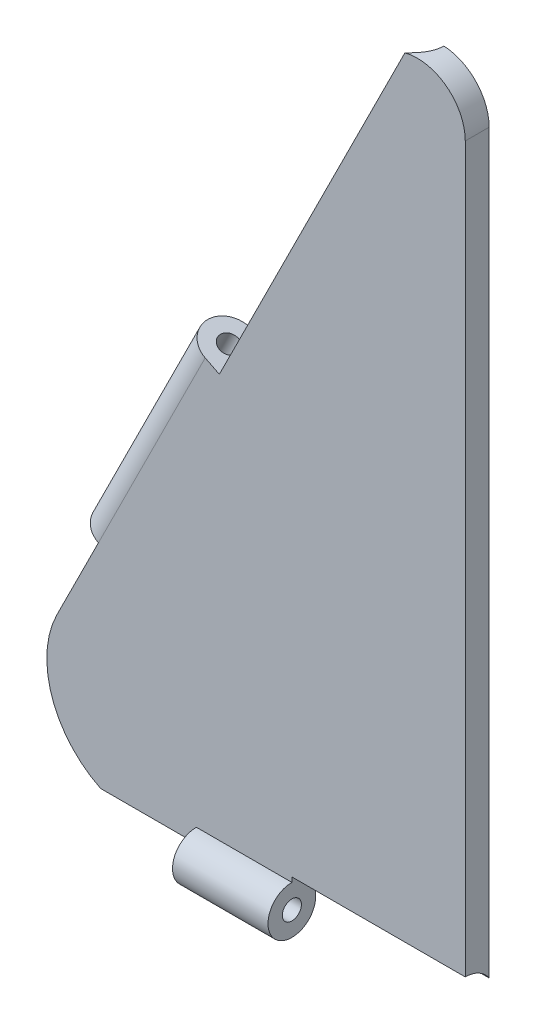
ISO-10303-21;
HEADER;
FILE_DESCRIPTION(('STEP AP214'),'2;1');
FILE_NAME('part.step','',(''),(''),'','','');
FILE_SCHEMA(('AUTOMOTIVE_DESIGN { 1 0 10303 214 1 1 1 1 }'));
ENDSEC;
DATA;
#1=APPLICATION_CONTEXT('core data for automotive mechanical design processes');
#2=APPLICATION_PROTOCOL_DEFINITION('international standard','automotive_design',2000,#1);
#3=PRODUCT_CONTEXT('',#1,'mechanical');
#4=PRODUCT('Part','Part','',(#3));
#5=PRODUCT_RELATED_PRODUCT_CATEGORY('part','',(#4));
#6=PRODUCT_DEFINITION_FORMATION('','',#4);
#7=PRODUCT_DEFINITION_CONTEXT('part definition',#1,'design');
#8=PRODUCT_DEFINITION('design','',#6,#7);
#9=PRODUCT_DEFINITION_SHAPE('','',#8);
#10=(LENGTH_UNIT() NAMED_UNIT(*) SI_UNIT(.MILLI.,.METRE.));
#11=(NAMED_UNIT(*) PLANE_ANGLE_UNIT() SI_UNIT($,.RADIAN.));
#12=(NAMED_UNIT(*) SI_UNIT($,.STERADIAN.) SOLID_ANGLE_UNIT());
#13=UNCERTAINTY_MEASURE_WITH_UNIT(LENGTH_MEASURE(1.E-05),#10,'distance_accuracy_value','');
#14=(GEOMETRIC_REPRESENTATION_CONTEXT(3) GLOBAL_UNCERTAINTY_ASSIGNED_CONTEXT((#13)) GLOBAL_UNIT_ASSIGNED_CONTEXT((#10,
#11,#12)) REPRESENTATION_CONTEXT('',''));
#15=CARTESIAN_POINT('',(0.,0.,0.));
#16=DIRECTION('',(0.,0.,1.));
#17=DIRECTION('',(1.,0.,0.));
#18=AXIS2_PLACEMENT_3D('',#15,#16,#17);
#19=CARTESIAN_POINT('',(-289.97718898323,96.6564322064938,5.));
#20=DIRECTION('',(0.,0.,-1.));
#21=DIRECTION('',(-1.,0.,0.));
#22=AXIS2_PLACEMENT_3D('',#19,#20,#21);
#23=PLANE('',#22);
#24=CARTESIAN_POINT('',(-289.97718898323,96.6564322064938,5.));
#25=DIRECTION('',(0.,0.,1.));
#26=DIRECTION('',(-1.,0.,0.));
#27=AXIS2_PLACEMENT_3D('',#24,#25,#26);
#28=CIRCLE('',#27,9.99999999999999);
#29=CARTESIAN_POINT('',(-298.921460893229,101.128568161494,5.));
#30=VERTEX_POINT('',#29);
#31=CARTESIAN_POINT('',(-294.33608792677,87.6564322064939,5.));
#32=VERTEX_POINT('',#31);
#33=EDGE_CURVE('E154',#30,#32,#28,.T.);
#34=ORIENTED_EDGE('',*,*,#33,.T.);
#35=DIRECTION('',(-1.,0.,0.));
#36=VECTOR('',#35,1.);
#37=CARTESIAN_POINT('',(-256.157528870729,87.6564322064939,5.));
#38=LINE('',#37,#36);
#39=CARTESIAN_POINT('',(-284.317358926979,87.6564322064939,5.));
#40=VERTEX_POINT('',#39);
#41=EDGE_CURVE('E143',#32,#40,#38,.F.);
#42=ORIENTED_EDGE('',*,*,#41,.T.);
#43=DIRECTION('',(0.,1.,0.));
#44=VECTOR('',#43,1.);
#45=CARTESIAN_POINT('',(-284.317358926979,96.6564322064938,5.));
#46=LINE('',#45,#44);
#47=CARTESIAN_POINT('',(-284.317358926979,89.1564322064939,5.));
#48=VERTEX_POINT('',#47);
#49=EDGE_CURVE('E151',#40,#48,#46,.T.);
#50=ORIENTED_EDGE('',*,*,#49,.T.);
#51=DIRECTION('',(1.,0.,0.));
#52=VECTOR('',#51,1.);
#53=CARTESIAN_POINT('',(-274.317358926979,89.1564322064939,5.));
#54=LINE('',#53,#52);
#55=CARTESIAN_POINT('',(-274.317358926979,89.1564322064939,5.));
#56=VERTEX_POINT('',#55);
#57=EDGE_CURVE('E162',#48,#56,#54,.T.);
#58=ORIENTED_EDGE('',*,*,#57,.T.);
#59=DIRECTION('',(0.,-1.,0.));
#60=VECTOR('',#59,1.);
#61=CARTESIAN_POINT('',(-274.317358926979,96.6564322064938,5.));
#62=LINE('',#61,#60);
#63=CARTESIAN_POINT('',(-274.317358926979,89.6564322064939,5.));
#64=VERTEX_POINT('',#63);
#65=EDGE_CURVE('E285',#64,#56,#62,.T.);
#66=ORIENTED_EDGE('',*,*,#65,.F.);
#67=DIRECTION('',(-1.,0.,0.));
#68=VECTOR('',#67,1.);
#69=CARTESIAN_POINT('',(-256.157528870729,89.6564322064939,5.));
#70=LINE('',#69,#68);
#71=CARTESIAN_POINT('',(-256.157528870729,89.6564322064939,5.));
#72=VERTEX_POINT('',#71);
#73=EDGE_CURVE('E277',#72,#64,#70,.T.);
#74=ORIENTED_EDGE('',*,*,#73,.F.);
#75=DIRECTION('',(0.,1.,0.));
#76=VECTOR('',#75,1.);
#77=CARTESIAN_POINT('',(-256.157528870729,86.6564322064939,5.));
#78=LINE('',#77,#76);
#79=CARTESIAN_POINT('',(-256.157528870729,165.476092318995,5.));
#80=VERTEX_POINT('',#79);
#81=EDGE_CURVE('E233',#72,#80,#78,.T.);
#82=ORIENTED_EDGE('',*,*,#81,.T.);
#83=CARTESIAN_POINT('',(-261.157528870729,165.476092318995,5.));
#84=DIRECTION('',(0.,0.,1.));
#85=DIRECTION('',(1.,0.,0.));
#86=AXIS2_PLACEMENT_3D('',#83,#84,#85);
#87=CIRCLE('',#86,5.00000000000001);
#88=CARTESIAN_POINT('',(-262.483107723135,170.297175258133,5.));
#89=VERTEX_POINT('',#88);
#90=EDGE_CURVE('E236',#80,#89,#87,.T.);
#91=ORIENTED_EDGE('',*,*,#90,.T.);
#92=DIRECTION('',(-0.447213595499958,-0.894427190999916,0.));
#93=VECTOR('',#92,1.);
#94=CARTESIAN_POINT('',(-261.146425128309,172.970540447785,5.));
#95=LINE('',#94,#93);
#96=CARTESIAN_POINT('',(-281.91035715081,131.442676402785,5.));
#97=VERTEX_POINT('',#96);
#98=EDGE_CURVE('E267',#97,#89,#95,.F.);
#99=ORIENTED_EDGE('',*,*,#98,.F.);
#100=DIRECTION('',(0.894427190999916,-0.447213595499958,0.));
#101=VECTOR('',#100,1.);
#102=CARTESIAN_POINT('',(-274.449324938229,127.712160296495,5.));
#103=LINE('',#102,#101);
#104=CARTESIAN_POINT('',(-283.393596848228,132.184296251494,5.));
#105=VERTEX_POINT('',#104);
#106=EDGE_CURVE('E173',#105,#97,#103,.T.);
#107=ORIENTED_EDGE('',*,*,#106,.F.);
#108=DIRECTION('',(0.447213595499958,0.894427190999916,0.));
#109=VECTOR('',#108,1.);
#110=CARTESIAN_POINT('',(-283.393596848229,132.184296251494,5.));
#111=LINE('',#110,#109);
#112=CARTESIAN_POINT('',(-294.573936735728,109.823616476496,5.));
#113=VERTEX_POINT('',#112);
#114=EDGE_CURVE('E228',#105,#113,#111,.F.);
#115=ORIENTED_EDGE('',*,*,#114,.T.);
#116=DIRECTION('',(-0.447213595499957,-0.894427190999916,0.));
#117=VECTOR('',#116,1.);
#118=CARTESIAN_POINT('',(-265.629664825728,167.712160296494,5.));
#119=LINE('',#118,#117);
#120=EDGE_CURVE('E239',#113,#30,#119,.T.);
#121=ORIENTED_EDGE('',*,*,#120,.T.);
#122=EDGE_LOOP('',(#34,#42,#50,#58,#66,#74,#82,#91,#99,#107,#115,#121));
#123=FACE_BOUND('',#122,.T.);
#124=ADVANCED_FACE('F41',(#123),#23,.F.);
#125=CARTESIAN_POINT('',(-289.97718898323,96.6564322064938,2.5));
#126=DIRECTION('',(0.,0.,-1.));
#127=DIRECTION('',(-1.,0.,0.));
#128=AXIS2_PLACEMENT_3D('',#125,#126,#127);
#129=PLANE('',#128);
#130=DIRECTION('',(0.,1.,0.));
#131=VECTOR('',#130,1.);
#132=CARTESIAN_POINT('',(-256.157528870729,86.6564322064939,2.5));
#133=LINE('',#132,#131);
#134=CARTESIAN_POINT('',(-256.157528870729,88.3147446016715,2.5));
#135=VERTEX_POINT('',#134);
#136=CARTESIAN_POINT('',(-256.157528870729,165.476092318995,2.5));
#137=VERTEX_POINT('',#136);
#138=EDGE_CURVE('E248',#135,#137,#133,.T.);
#139=ORIENTED_EDGE('',*,*,#138,.F.);
#140=DIRECTION('',(-1.,0.,0.));
#141=VECTOR('',#140,1.);
#142=CARTESIAN_POINT('',(-256.157528870729,88.3147446016715,2.5));
#143=LINE('',#142,#141);
#144=CARTESIAN_POINT('',(-274.317358926979,88.3147446016715,2.5));
#145=VERTEX_POINT('',#144);
#146=EDGE_CURVE('E64',#135,#145,#143,.T.);
#147=ORIENTED_EDGE('',*,*,#146,.T.);
#148=DIRECTION('',(0.,-1.,0.));
#149=VECTOR('',#148,1.);
#150=CARTESIAN_POINT('',(-274.317358926979,96.6564322064938,2.5));
#151=LINE('',#150,#149);
#152=CARTESIAN_POINT('',(-274.317358926979,86.6564322064939,2.5));
#153=VERTEX_POINT('',#152);
#154=EDGE_CURVE('E282',#145,#153,#151,.T.);
#155=ORIENTED_EDGE('',*,*,#154,.T.);
#156=DIRECTION('',(1.,0.,0.));
#157=VECTOR('',#156,1.);
#158=CARTESIAN_POINT('',(-289.97718898323,86.6564322064939,2.5));
#159=LINE('',#158,#157);
#160=CARTESIAN_POINT('',(-284.317358926979,86.6564322064939,2.5));
#161=VERTEX_POINT('',#160);
#162=EDGE_CURVE('E244',#161,#153,#159,.T.);
#163=ORIENTED_EDGE('',*,*,#162,.F.);
#164=CARTESIAN_POINT('',(-289.97718898323,86.6564322064939,2.5));
#165=VERTEX_POINT('',#164);
#166=EDGE_CURVE('E245',#165,#161,#159,.T.);
#167=ORIENTED_EDGE('',*,*,#166,.F.);
#168=CARTESIAN_POINT('',(-289.97718898323,96.6564322064938,2.5));
#169=DIRECTION('',(0.,0.,1.));
#170=DIRECTION('',(-1.,0.,0.));
#171=AXIS2_PLACEMENT_3D('',#168,#169,#170);
#172=CIRCLE('',#171,9.99999999999999);
#173=CARTESIAN_POINT('',(-299.976392571191,96.7826368280703,2.5));
#174=VERTEX_POINT('',#173);
#175=EDGE_CURVE('E231',#174,#165,#172,.T.);
#176=ORIENTED_EDGE('',*,*,#175,.F.);
#177=DIRECTION('',(0.447213595499958,0.894427190999916,0.));
#178=VECTOR('',#177,1.);
#179=CARTESIAN_POINT('',(-304.027033702229,88.6813545659935,2.5));
#180=LINE('',#179,#178);
#181=CARTESIAN_POINT('',(-293.679509544728,109.376402880996,2.5));
#182=VERTEX_POINT('',#181);
#183=EDGE_CURVE('E348',#182,#174,#180,.F.);
#184=ORIENTED_EDGE('',*,*,#183,.F.);
#185=DIRECTION('',(0.894427190999916,-0.447213595499958,0.));
#186=VECTOR('',#185,1.);
#187=CARTESIAN_POINT('',(-285.629664825728,105.351480521497,2.5));
#188=LINE('',#187,#186);
#189=CARTESIAN_POINT('',(-292.337868758228,108.705582487746,2.5));
#190=VERTEX_POINT('',#189);
#191=EDGE_CURVE('E262',#182,#190,#188,.T.);
#192=ORIENTED_EDGE('',*,*,#191,.T.);
#193=DIRECTION('',(0.447213595499958,0.894427190999916,0.));
#194=VECTOR('',#193,1.);
#195=CARTESIAN_POINT('',(-281.157528870729,131.066262262744,2.5));
#196=LINE('',#195,#194);
#197=CARTESIAN_POINT('',(-281.157528870729,131.066262262744,2.5));
#198=VERTEX_POINT('',#197);
#199=EDGE_CURVE('E259',#190,#198,#196,.T.);
#200=ORIENTED_EDGE('',*,*,#199,.T.);
#201=DIRECTION('',(0.894427190999916,-0.447213595499958,0.));
#202=VECTOR('',#201,1.);
#203=CARTESIAN_POINT('',(-274.449324938229,127.712160296495,2.5));
#204=LINE('',#203,#202);
#205=CARTESIAN_POINT('',(-280.710315275229,130.842655464994,2.5));
#206=VERTEX_POINT('',#205);
#207=EDGE_CURVE('E174',#198,#206,#204,.T.);
#208=ORIENTED_EDGE('',*,*,#207,.T.);
#209=DIRECTION('',(-0.447213595499958,-0.894427190999916,0.));
#210=VECTOR('',#209,1.);
#211=CARTESIAN_POINT('',(-259.946383252729,172.370519509995,2.5));
#212=LINE('',#211,#210);
#213=CARTESIAN_POINT('',(-260.896993099537,170.469299816379,2.5));
#214=VERTEX_POINT('',#213);
#215=EDGE_CURVE('E186',#206,#214,#212,.F.);
#216=ORIENTED_EDGE('',*,*,#215,.T.);
#217=CARTESIAN_POINT('',(-261.157528870729,165.476092318995,2.5));
#218=DIRECTION('',(0.,0.,1.));
#219=DIRECTION('',(1.,0.,0.));
#220=AXIS2_PLACEMENT_3D('',#217,#218,#219);
#221=CIRCLE('',#220,5.00000000000001);
#222=EDGE_CURVE('E234',#137,#214,#221,.T.);
#223=ORIENTED_EDGE('',*,*,#222,.F.);
#224=EDGE_LOOP('',(#139,#147,#155,#163,#167,#176,#184,#192,#200,#208,#216,#223));
#225=FACE_BOUND('',#224,.T.);
#226=ADVANCED_FACE('F280',(#225),#129,.T.);
#227=CARTESIAN_POINT('',(-261.157528870729,165.476092318995,5.));
#228=DIRECTION('',(0.,0.,-1.));
#229=DIRECTION('',(-1.,0.,0.));
#230=AXIS2_PLACEMENT_3D('',#227,#228,#229);
#231=CYLINDRICAL_SURFACE('',#230,5.00000000000001);
#232=CARTESIAN_POINT('',(-262.483107723135,170.297175258133,5.));
#233=CARTESIAN_POINT('',(-262.415716111207,170.315719059544,4.9655324200361));
#234=CARTESIAN_POINT('',(-262.349071966782,170.332509356824,4.92862485870295));
#235=CARTESIAN_POINT('',(-262.217966837228,170.362805234737,4.84986223942166));
#236=CARTESIAN_POINT('',(-262.153506635118,170.376309647771,4.80800543064691));
#237=CARTESIAN_POINT('',(-262.027549535544,170.400235012611,4.71933149875573));
#238=CARTESIAN_POINT('',(-261.966050641575,170.410658066933,4.67251778766392));
#239=CARTESIAN_POINT('',(-261.846674672903,170.428740124268,4.5740109435555));
#240=CARTESIAN_POINT('',(-261.788796988489,170.436399593633,4.52231863565622));
#241=CARTESIAN_POINT('',(-261.677142974284,170.449337789894,4.41410188734112));
#242=CARTESIAN_POINT('',(-261.62337848022,170.454609846441,4.35756442680453));
#243=CARTESIAN_POINT('',(-261.520688491533,170.463152732589,4.24007481697005));
#244=CARTESIAN_POINT('',(-261.471764890712,170.466422781561,4.1791209559625));
#245=CARTESIAN_POINT('',(-261.379310820747,170.471385759467,4.05326950522852));
#246=CARTESIAN_POINT('',(-261.335775610379,170.47308008355,3.98837545849816));
#247=CARTESIAN_POINT('',(-261.254436194735,170.475318349718,3.85506169671378));
#248=CARTESIAN_POINT('',(-261.216633996719,170.475861889744,3.78664075799628));
#249=CARTESIAN_POINT('',(-261.114663015048,170.476363997073,3.5815492335225));
#250=CARTESIAN_POINT('',(-261.058735783295,170.475305987785,3.44067423725507));
#251=CARTESIAN_POINT('',(-260.971053026605,170.472808902583,3.15170387467061));
#252=CARTESIAN_POINT('',(-260.939281021104,170.471370087389,3.00361350477626));
#253=CARTESIAN_POINT('',(-260.91223649863,170.470075564385,2.79531407576827));
#254=CARTESIAN_POINT('',(-260.906515175367,170.469789041959,2.73632567867028));
#255=CARTESIAN_POINT('',(-260.898898877662,170.469400318968,2.61823252503312));
#256=CARTESIAN_POINT('',(-260.896995478369,170.469297712616,2.55912831341277));
#257=CARTESIAN_POINT('',(-260.896993099537,170.469299816379,2.5));
#258=B_SPLINE_CURVE_WITH_KNOTS('',3,(#232,#233,#234,#235,#236,#237,#238,#239,#240,#241,#242,
#243,#244,#245,#246,#247,#248,#249,#250,#251,#252,#253,#254,#255,#256,#257),.UNSPECIFIED.,.F.,
.F.,(4,2,2,2,2,2,2,2,2,2,2,2,4),(0.,0.233761557043679,0.467606057478183,0.701290627538849,
0.934935745102631,1.16922969134545,1.40361493612553,1.63779245750554,1.8720517814871,
2.32453085501987,2.77670093458525,2.95439950043459,3.13170551305746),.UNSPECIFIED.);
#259=EDGE_CURVE('E177',#89,#214,#258,.T.);
#260=ORIENTED_EDGE('',*,*,#259,.F.);
#261=ORIENTED_EDGE('',*,*,#90,.F.);
#262=DIRECTION('',(0.,0.,-1.));
#263=VECTOR('',#262,1.);
#264=CARTESIAN_POINT('',(-256.157528870729,165.476092318995,5.));
#265=LINE('',#264,#263);
#266=EDGE_CURVE('E254',#80,#137,#265,.T.);
#267=ORIENTED_EDGE('',*,*,#266,.T.);
#268=ORIENTED_EDGE('',*,*,#222,.T.);
#269=EDGE_LOOP('',(#260,#261,#267,#268));
#270=FACE_BOUND('',#269,.T.);
#271=ADVANCED_FACE('F188',(#270),#231,.T.);
#272=CARTESIAN_POINT('',(-304.921460893229,89.1285681614935,2.50000000000001));
#273=DIRECTION('',(0.447213595499958,0.894427190999916,0.));
#274=DIRECTION('',(-0.894427190999916,0.447213595499958,0.));
#275=AXIS2_PLACEMENT_3D('',#272,#273,#274);
#276=CYLINDRICAL_SURFACE('',#275,1.);
#277=DIRECTION('',(0.447213595499958,0.894427190999916,0.));
#278=VECTOR('',#277,1.);
#279=CARTESIAN_POINT('',(-304.921460893229,89.1285681614934,3.50000000000001));
#280=LINE('',#279,#278);
#281=CARTESIAN_POINT('',(-294.573936735727,109.823616476496,3.50000000000001));
#282=VERTEX_POINT('',#281);
#283=CARTESIAN_POINT('',(-298.921460893229,101.128568161494,3.50000000000001));
#284=VERTEX_POINT('',#283);
#285=EDGE_CURVE('E219',#282,#284,#280,.F.);
#286=ORIENTED_EDGE('',*,*,#285,.F.);
#287=CARTESIAN_POINT('',(-294.573936735728,109.823616476496,2.5));
#288=DIRECTION('',(0.447213595499958,0.894427190999916,0.));
#289=DIRECTION('',(-0.894427190999916,0.447213595499958,0.));
#290=AXIS2_PLACEMENT_3D('',#287,#288,#289);
#291=CIRCLE('',#290,1.);
#292=EDGE_CURVE('E341',#182,#282,#291,.T.);
#293=ORIENTED_EDGE('',*,*,#292,.F.);
#294=ORIENTED_EDGE('',*,*,#183,.T.);
#295=CARTESIAN_POINT('',(-298.921460893229,101.128568161494,3.50000000000001));
#296=CARTESIAN_POINT('',(-298.95865040879,101.054189061791,3.49999491608721));
#297=CARTESIAN_POINT('',(-298.994910518401,100.979349305112,3.50000068352231));
#298=CARTESIAN_POINT('',(-299.065552937991,100.828788395489,3.49998963470581));
#299=CARTESIAN_POINT('',(-299.099935240874,100.753067239214,3.49997281836886));
#300=CARTESIAN_POINT('',(-299.200264896595,100.524577832376,3.49982202069693));
#301=CARTESIAN_POINT('',(-299.263363428446,100.370546781616,3.49958761988173));
#302=CARTESIAN_POINT('',(-299.382827992735,100.056818205615,3.49791920702614));
#303=CARTESIAN_POINT('',(-299.439056901394,99.8970686896607,3.49646427609117));
#304=CARTESIAN_POINT('',(-299.543305826681,99.5749998863792,3.49068322015695));
#305=CARTESIAN_POINT('',(-299.591328548928,99.4126814653918,3.48635804379659));
#306=CARTESIAN_POINT('',(-299.666662026466,99.13208599595,3.47436444408183));
#307=CARTESIAN_POINT('',(-299.695994841073,99.014295674369,3.46798255060903));
#308=CARTESIAN_POINT('',(-299.750312495443,98.7779313527407,3.45124064097266));
#309=CARTESIAN_POINT('',(-299.775295756188,98.6593570842443,3.44087918446583));
#310=CARTESIAN_POINT('',(-299.820660655041,98.422910076756,3.41465886078259));
#311=CARTESIAN_POINT('',(-299.841077404391,98.3050392851011,3.39884449748422));
#312=CARTESIAN_POINT('',(-299.877497744487,98.0699338494939,3.35953262811755));
#313=CARTESIAN_POINT('',(-299.893505911528,97.9526986706597,3.3360431449715));
#314=CARTESIAN_POINT('',(-299.915238067285,97.7698550256748,3.290423314091));
#315=CARTESIAN_POINT('',(-299.922439492405,97.7035077181278,3.27196854026365));
#316=CARTESIAN_POINT('',(-299.93543214121,97.5717378547777,3.23041285200044));
#317=CARTESIAN_POINT('',(-299.941216274645,97.5063214310834,3.2072895923906));
#318=CARTESIAN_POINT('',(-299.949624923239,97.399625122796,3.16409218942733));
#319=CARTESIAN_POINT('',(-299.952654581407,97.3577135812109,3.14566225489112));
#320=CARTESIAN_POINT('',(-299.958109228748,97.2752508483158,3.10577312647903));
#321=CARTESIAN_POINT('',(-299.960533710166,97.2347008238643,3.08431141236493));
#322=CARTESIAN_POINT('',(-299.964783230932,97.1559374755088,3.03795060108822));
#323=CARTESIAN_POINT('',(-299.966612336372,97.1177098167123,3.01307654319196));
#324=CARTESIAN_POINT('',(-299.969728311021,97.0443703858912,2.9591198334879));
#325=CARTESIAN_POINT('',(-299.971016413781,97.0092516711312,2.93004696130319));
#326=CARTESIAN_POINT('',(-299.972807831688,96.9533250296045,2.8761630523642));
#327=CARTESIAN_POINT('',(-299.97343049074,96.9313355780481,2.8525922939812));
#328=CARTESIAN_POINT('',(-299.97446784663,96.8905899104965,2.80272397992185));
#329=CARTESIAN_POINT('',(-299.974882414391,96.8718357059777,2.77642474400104));
#330=CARTESIAN_POINT('',(-299.975544981152,96.8385300401726,2.72073952856831));
#331=CARTESIAN_POINT('',(-299.975790620761,96.8240396654869,2.69131620227033));
#332=CARTESIAN_POINT('',(-299.976149296136,96.8011002660988,2.63022893794725));
#333=CARTESIAN_POINT('',(-299.976262856026,96.7926274149452,2.59857438839988));
#334=CARTESIAN_POINT('',(-299.976349327472,96.7860243991196,2.55544083368186));
#335=CARTESIAN_POINT('',(-299.976365616683,96.7847573334741,2.54439550994269));
#336=CARTESIAN_POINT('',(-299.976387214626,96.7830635153109,2.52223574467683));
#337=CARTESIAN_POINT('',(-299.976392518465,96.7826371372784,2.51112127455921));
#338=CARTESIAN_POINT('',(-299.976392571191,96.7826368280703,2.5));
#339=B_SPLINE_CURVE_WITH_KNOTS('',3,(#295,#296,#297,#298,#299,#300,#301,#302,#303,#304,#305,
#306,#307,#308,#309,#310,#311,#312,#313,#314,#315,#316,#317,#318,#319,#320,#321,#322,#323,#324,
#325,#326,#327,#328,#329,#330,#331,#332,#333,#334,#335,#336,#337,#338),.UNSPECIFIED.,.F.,.F.,(4,
2,2,2,2,2,2,2,2,2,2,2,2,2,2,2,2,2,2,2,2,4),(0.,0.249461333495875,0.498923609639034,
0.998059693290644,1.50592960407737,2.01363174337159,2.3781812915898,2.74286290758575,
3.10463599237655,3.46603211351351,3.67363266970347,3.88225150002738,4.01981071031343,
4.15748495028787,4.29419819793304,4.43059800849131,4.52710623306148,4.62367424589049,
4.72156501613228,4.81906599260344,4.85239358819603,4.8857360262461),.UNSPECIFIED.);
#340=EDGE_CURVE('E210',#284,#174,#339,.T.);
#341=ORIENTED_EDGE('',*,*,#340,.F.);
#342=EDGE_LOOP('',(#286,#293,#294,#341));
#343=FACE_BOUND('',#342,.T.);
#344=CARTESIAN_POINT('',(-283.393596848229,132.184296251494,2.5));
#345=DIRECTION('',(-0.447213595499958,-0.894427190999916,0.));
#346=DIRECTION('',(0.894427190999916,-0.447213595499958,0.));
#347=AXIS2_PLACEMENT_3D('',#344,#345,#346);
#348=CIRCLE('',#347,1.);
#349=CARTESIAN_POINT('',(-282.499169657229,131.737082655994,2.5));
#350=VERTEX_POINT('',#349);
#351=EDGE_CURVE('E264',#350,#350,#348,.T.);
#352=ORIENTED_EDGE('',*,*,#351,.F.);
#353=EDGE_LOOP('',(#352));
#354=FACE_BOUND('',#353,.T.);
#355=ADVANCED_FACE('F201',(#343,#354),#276,.F.);
#356=CARTESIAN_POINT('',(-265.629664825728,167.712160296494,5.));
#357=DIRECTION('',(0.894427190999916,-0.447213595499957,0.));
#358=DIRECTION('',(0.447213595499958,0.894427190999916,0.));
#359=AXIS2_PLACEMENT_3D('',#356,#357,#358);
#360=PLANE('',#359);
#361=DIRECTION('',(0.,0.,1.));
#362=VECTOR('',#361,1.);
#363=CARTESIAN_POINT('',(-294.573936735727,109.823616476496,5.00000000000001));
#364=LINE('',#363,#362);
#365=EDGE_CURVE('E226',#282,#113,#364,.T.);
#366=ORIENTED_EDGE('',*,*,#365,.F.);
#367=ORIENTED_EDGE('',*,*,#285,.T.);
#368=DIRECTION('',(0.,0.,-1.));
#369=VECTOR('',#368,1.);
#370=CARTESIAN_POINT('',(-298.921460893229,101.128568161494,5.));
#371=LINE('',#370,#369);
#372=EDGE_CURVE('E241',#30,#284,#371,.T.);
#373=ORIENTED_EDGE('',*,*,#372,.F.);
#374=ORIENTED_EDGE('',*,*,#120,.F.);
#375=EDGE_LOOP('',(#366,#367,#373,#374));
#376=FACE_BOUND('',#375,.T.);
#377=ADVANCED_FACE('F205',(#376),#360,.F.);
#378=CARTESIAN_POINT('',(-289.97718898323,96.6564322064938,5.));
#379=DIRECTION('',(0.,0.,-1.));
#380=DIRECTION('',(-1.,0.,0.));
#381=AXIS2_PLACEMENT_3D('',#378,#379,#380);
#382=CYLINDRICAL_SURFACE('',#381,9.99999999999999);
#383=DIRECTION('',(0.,0.,-1.));
#384=VECTOR('',#383,1.);
#385=CARTESIAN_POINT('',(-289.97718898323,86.6564322064939,5.));
#386=LINE('',#385,#384);
#387=CARTESIAN_POINT('',(-289.97718898323,86.6564322064939,4.00000000000003));
#388=VERTEX_POINT('',#387);
#389=EDGE_CURVE('E257',#388,#165,#386,.T.);
#390=ORIENTED_EDGE('',*,*,#389,.F.);
#391=CARTESIAN_POINT('',(-289.97718898323,86.6564322064939,4.00000000000003));
#392=CARTESIAN_POINT('',(-290.060347329415,86.6564322371641,4.00000508391282));
#393=CARTESIAN_POINT('',(-290.143502056748,86.6574695658497,3.99999931647772));
#394=CARTESIAN_POINT('',(-290.309760078677,86.6616179506645,4.00001036529423));
#395=CARTESIAN_POINT('',(-290.392863373077,86.6647290146298,4.00002718163117));
#396=CARTESIAN_POINT('',(-290.642099297479,86.6771750116551,4.0001779793031));
#397=CARTESIAN_POINT('',(-290.808087378836,86.6896227490841,4.00041238011829));
#398=CARTESIAN_POINT('',(-291.142120925136,86.723074078908,4.00208079297388));
#399=CARTESIAN_POINT('',(-291.310151568367,86.7442235694928,4.00353572390885));
#400=CARTESIAN_POINT('',(-291.644840200099,86.795014043597,4.00931677984306));
#401=CARTESIAN_POINT('',(-291.811498623712,86.8246522196994,4.01364195620341));
#402=CARTESIAN_POINT('',(-292.096160996604,86.882758017767,4.02563555591816));
#403=CARTESIAN_POINT('',(-292.214633896549,86.9091993840232,4.03201744939096));
#404=CARTESIAN_POINT('',(-292.450336166306,86.9663215351262,4.04875935902733));
#405=CARTESIAN_POINT('',(-292.567565070067,86.9970038523449,4.05912081553416));
#406=CARTESIAN_POINT('',(-292.799337502321,87.0621705696573,4.0853411392174));
#407=CARTESIAN_POINT('',(-292.913894991287,87.096622694427,4.10115550251577));
#408=CARTESIAN_POINT('',(-293.140467356889,87.1691896991198,4.14046737188243));
#409=CARTESIAN_POINT('',(-293.25248475852,87.2073007250854,4.1639568550285));
#410=CARTESIAN_POINT('',(-293.42574400181,87.2696330579457,4.20957668590902));
#411=CARTESIAN_POINT('',(-293.488307412951,87.2928633254638,4.22803145973638));
#412=CARTESIAN_POINT('',(-293.611976450873,87.3401716214567,4.26958714799959));
#413=CARTESIAN_POINT('',(-293.673073422073,87.3642532492816,4.29271040760943));
#414=CARTESIAN_POINT('',(-293.772265963355,87.4044483649955,4.33590781057271));
#415=CARTESIAN_POINT('',(-293.811107690088,87.4204819675553,4.35433774510892));
#416=CARTESIAN_POINT('',(-293.887303993083,87.4524816379292,4.39422687352101));
#417=CARTESIAN_POINT('',(-293.924657298601,87.4684476380577,4.41568858763512));
#418=CARTESIAN_POINT('',(-293.997005822485,87.4998707913474,4.46204939891184));
#419=CARTESIAN_POINT('',(-294.032015680781,87.5153307184449,4.48692345680808));
#420=CARTESIAN_POINT('',(-294.099005968107,87.5453420965411,4.54088016651213));
#421=CARTESIAN_POINT('',(-294.130993158567,87.5598955491054,4.56995303869684));
#422=CARTESIAN_POINT('',(-294.181816613893,87.5833044106604,4.62383694763583));
#423=CARTESIAN_POINT('',(-294.201763038874,87.5925814691666,4.64740770601884));
#424=CARTESIAN_POINT('',(-294.238670991505,87.6098756463394,4.69727602007819));
#425=CARTESIAN_POINT('',(-294.255630662311,87.6178919808942,4.72357525599899));
#426=CARTESIAN_POINT('',(-294.285716464285,87.6321941097234,4.77926047143172));
#427=CARTESIAN_POINT('',(-294.298786902784,87.6384546955409,4.8086837977297));
#428=CARTESIAN_POINT('',(-294.319464929847,87.6483926978113,4.86977106205278));
#429=CARTESIAN_POINT('',(-294.32709406383,87.6520803009864,4.90142561160015));
#430=CARTESIAN_POINT('',(-294.333038651933,87.6549559170229,4.94455916631816));
#431=CARTESIAN_POINT('',(-294.334179234656,87.6555079964925,4.95560449005733));
#432=CARTESIAN_POINT('',(-294.335703890572,87.6562461772158,4.97776425532318));
#433=CARTESIAN_POINT('',(-294.336087626626,87.6564321153714,4.9888787254408));
#434=CARTESIAN_POINT('',(-294.33608792677,87.6564322064939,5.));
#435=B_SPLINE_CURVE_WITH_KNOTS('',3,(#391,#392,#393,#394,#395,#396,#397,#398,#399,#400,#401,
#402,#403,#404,#405,#406,#407,#408,#409,#410,#411,#412,#413,#414,#415,#416,#417,#418,#419,#420,
#421,#422,#423,#424,#425,#426,#427,#428,#429,#430,#431,#432,#433,#434),.UNSPECIFIED.,.F.,.F.,(4,
2,2,2,2,2,2,2,2,2,2,2,2,2,2,2,2,2,2,2,2,4),(0.,0.249461333495909,0.498923609639044,
0.998059693290569,1.50592960407737,2.01363174337156,2.37818129158989,2.74286290758596,
3.1046359923768,3.46603211351395,3.67363266970387,3.88225150002784,4.01981071031386,
4.15748495028831,4.29419819793347,4.43059800849172,4.5271062330619,4.62367424589087,
4.72156501613267,4.81906599260383,4.8523935881964,4.88573602624645),.UNSPECIFIED.);
#436=EDGE_CURVE('E156',#388,#32,#435,.T.);
#437=ORIENTED_EDGE('',*,*,#436,.T.);
#438=ORIENTED_EDGE('',*,*,#33,.F.);
#439=ORIENTED_EDGE('',*,*,#372,.T.);
#440=ORIENTED_EDGE('',*,*,#340,.T.);
#441=ORIENTED_EDGE('',*,*,#175,.T.);
#442=EDGE_LOOP('',(#390,#437,#438,#439,#440,#441));
#443=FACE_BOUND('',#442,.T.);
#444=ADVANCED_FACE('F43',(#443),#382,.T.);
#445=CARTESIAN_POINT('',(-289.97718898323,86.6564322064939,5.));
#446=DIRECTION('',(0.,1.,0.));
#447=DIRECTION('',(0.,0.,1.));
#448=AXIS2_PLACEMENT_3D('',#445,#446,#447);
#449=PLANE('',#448);
#450=DIRECTION('',(0.,0.,1.));
#451=VECTOR('',#450,1.);
#452=CARTESIAN_POINT('',(-284.317358926979,86.6564322064939,5.));
#453=LINE('',#452,#451);
#454=CARTESIAN_POINT('',(-284.317358926979,86.6564322064939,4.00000000000003));
#455=VERTEX_POINT('',#454);
#456=EDGE_CURVE('E50',#161,#455,#453,.T.);
#457=ORIENTED_EDGE('',*,*,#456,.T.);
#458=DIRECTION('',(-1.,0.,0.));
#459=VECTOR('',#458,1.);
#460=CARTESIAN_POINT('',(-256.157528870729,86.6564322064939,4.00000000000003));
#461=LINE('',#460,#459);
#462=EDGE_CURVE('E56',#455,#388,#461,.T.);
#463=ORIENTED_EDGE('',*,*,#462,.T.);
#464=ORIENTED_EDGE('',*,*,#389,.T.);
#465=ORIENTED_EDGE('',*,*,#166,.T.);
#466=EDGE_LOOP('',(#457,#463,#464,#465));
#467=FACE_BOUND('',#466,.T.);
#468=ADVANCED_FACE('F269',(#467),#449,.F.);
#469=CARTESIAN_POINT('',(-256.157528870729,86.6564322064939,5.));
#470=DIRECTION('',(-1.,0.,0.));
#471=DIRECTION('',(0.,0.,1.));
#472=AXIS2_PLACEMENT_3D('',#469,#470,#471);
#473=PLANE('',#472);
#474=CARTESIAN_POINT('',(-256.157528870729,86.6564322064939,5.00000000000003));
#475=DIRECTION('',(1.,0.,0.));
#476=DIRECTION('',(0.,0.,-1.));
#477=AXIS2_PLACEMENT_3D('',#474,#475,#476);
#478=CIRCLE('',#477,3.);
#479=EDGE_CURVE('E286',#135,#72,#478,.T.);
#480=ORIENTED_EDGE('',*,*,#479,.F.);
#481=ORIENTED_EDGE('',*,*,#138,.T.);
#482=ORIENTED_EDGE('',*,*,#266,.F.);
#483=ORIENTED_EDGE('',*,*,#81,.F.);
#484=EDGE_LOOP('',(#480,#481,#482,#483));
#485=FACE_BOUND('',#484,.T.);
#486=ADVANCED_FACE('F356',(#485),#473,.F.);
#487=CARTESIAN_POINT('',(-294.573936735728,109.823616476496,5.00000000000001));
#488=DIRECTION('',(0.447213595499958,0.894427190999916,0.));
#489=DIRECTION('',(-0.894427190999916,0.447213595499958,0.));
#490=AXIS2_PLACEMENT_3D('',#487,#488,#489);
#491=PLANE('',#490);
#492=ORIENTED_EDGE('',*,*,#191,.F.);
#493=ORIENTED_EDGE('',*,*,#292,.T.);
#494=ORIENTED_EDGE('',*,*,#365,.T.);
#495=CARTESIAN_POINT('',(-294.573936735728,109.823616476496,2.5));
#496=DIRECTION('',(0.447213595499958,0.894427190999916,0.));
#497=DIRECTION('',(-0.894427190999916,0.447213595499958,0.));
#498=AXIS2_PLACEMENT_3D('',#495,#496,#497);
#499=CIRCLE('',#498,2.50000000000001);
#500=EDGE_CURVE('E223',#190,#113,#499,.T.);
#501=ORIENTED_EDGE('',*,*,#500,.F.);
#502=EDGE_LOOP('',(#492,#493,#494,#501));
#503=FACE_BOUND('',#502,.T.);
#504=ADVANCED_FACE('F340',(#503),#491,.F.);
#505=CARTESIAN_POINT('',(-283.393596848229,132.184296251494,5.));
#506=DIRECTION('',(-0.447213595499958,-0.894427190999916,0.));
#507=DIRECTION('',(0.894427190999916,-0.447213595499958,0.));
#508=AXIS2_PLACEMENT_3D('',#505,#506,#507);
#509=PLANE('',#508);
#510=ORIENTED_EDGE('',*,*,#351,.T.);
#511=EDGE_LOOP('',(#510));
#512=FACE_BOUND('',#511,.T.);
#513=CARTESIAN_POINT('',(-283.393596848229,132.184296251494,2.5));
#514=DIRECTION('',(0.447213595499958,0.894427190999916,0.));
#515=DIRECTION('',(-0.894427190999916,0.447213595499958,0.));
#516=AXIS2_PLACEMENT_3D('',#513,#514,#515);
#517=CIRCLE('',#516,2.5);
#518=EDGE_CURVE('E218',#198,#105,#517,.T.);
#519=ORIENTED_EDGE('',*,*,#518,.T.);
#520=ORIENTED_EDGE('',*,*,#106,.T.);
#521=CARTESIAN_POINT('',(-283.393596848229,132.184296251494,2.49999999999999));
#522=DIRECTION('',(0.447213595499958,0.894427190999916,0.));
#523=DIRECTION('',(-0.894427190999916,0.447213595499958,0.));
#524=AXIS2_PLACEMENT_3D('',#521,#522,#523);
#525=CIRCLE('',#524,2.99999999999996);
#526=EDGE_CURVE('E165',#97,#206,#525,.T.);
#527=ORIENTED_EDGE('',*,*,#526,.T.);
#528=ORIENTED_EDGE('',*,*,#207,.F.);
#529=EDGE_LOOP('',(#519,#520,#527,#528));
#530=FACE_BOUND('',#529,.T.);
#531=ADVANCED_FACE('F207',(#512,#530),#509,.F.);
#532=CARTESIAN_POINT('',(-283.393596848229,132.184296251494,2.5));
#533=DIRECTION('',(0.447213595499958,0.894427190999916,0.));
#534=DIRECTION('',(-0.894427190999916,0.447213595499958,0.));
#535=AXIS2_PLACEMENT_3D('',#532,#533,#534);
#536=CYLINDRICAL_SURFACE('',#535,2.50000000000001);
#537=ORIENTED_EDGE('',*,*,#114,.F.);
#538=ORIENTED_EDGE('',*,*,#518,.F.);
#539=ORIENTED_EDGE('',*,*,#199,.F.);
#540=ORIENTED_EDGE('',*,*,#500,.T.);
#541=EDGE_LOOP('',(#537,#538,#539,#540));
#542=FACE_BOUND('',#541,.T.);
#543=ADVANCED_FACE('F198',(#542),#536,.T.);
#544=CARTESIAN_POINT('',(-262.629664825728,173.712160296495,2.49999999999999));
#545=DIRECTION('',(-0.447213595499958,-0.894427190999916,0.));
#546=DIRECTION('',(0.894427190999916,-0.447213595499958,0.));
#547=AXIS2_PLACEMENT_3D('',#544,#545,#546);
#548=CYLINDRICAL_SURFACE('',#547,2.99999999999996);
#549=ORIENTED_EDGE('',*,*,#526,.F.);
#550=ORIENTED_EDGE('',*,*,#98,.T.);
#551=ORIENTED_EDGE('',*,*,#259,.T.);
#552=ORIENTED_EDGE('',*,*,#215,.F.);
#553=EDGE_LOOP('',(#549,#550,#551,#552));
#554=FACE_BOUND('',#553,.T.);
#555=ADVANCED_FACE('F192',(#554),#548,.F.);
#556=CARTESIAN_POINT('',(-274.317358926979,86.6564322064939,2.5));
#557=DIRECTION('',(-1.,0.,0.));
#558=DIRECTION('',(0.,0.,1.));
#559=AXIS2_PLACEMENT_3D('',#556,#557,#558);
#560=PLANE('',#559);
#561=CARTESIAN_POINT('',(-274.317358926979,86.6564322064939,5.00000000000003));
#562=DIRECTION('',(-1.,0.,0.));
#563=DIRECTION('',(0.,0.,1.));
#564=AXIS2_PLACEMENT_3D('',#561,#562,#563);
#565=CIRCLE('',#564,1.);
#566=CARTESIAN_POINT('',(-274.317358926979,86.6564322064939,6.00000000000003));
#567=VERTEX_POINT('',#566);
#568=EDGE_CURVE('E155',#567,#567,#565,.T.);
#569=ORIENTED_EDGE('',*,*,#568,.T.);
#570=EDGE_LOOP('',(#569));
#571=FACE_BOUND('',#570,.T.);
#572=ORIENTED_EDGE('',*,*,#65,.T.);
#573=CARTESIAN_POINT('',(-274.317358926979,86.6564322064939,5.));
#574=DIRECTION('',(1.,0.,0.));
#575=DIRECTION('',(0.,0.,-1.));
#576=AXIS2_PLACEMENT_3D('',#573,#574,#575);
#577=CIRCLE('',#576,2.5);
#578=EDGE_CURVE('E163',#56,#153,#577,.T.);
#579=ORIENTED_EDGE('',*,*,#578,.T.);
#580=ORIENTED_EDGE('',*,*,#154,.F.);
#581=CARTESIAN_POINT('',(-274.317358926979,86.6564322064939,5.00000000000002));
#582=DIRECTION('',(1.,0.,0.));
#583=DIRECTION('',(0.,0.,-1.));
#584=AXIS2_PLACEMENT_3D('',#581,#582,#583);
#585=CIRCLE('',#584,3.);
#586=EDGE_CURVE('E289',#145,#64,#585,.T.);
#587=ORIENTED_EDGE('',*,*,#586,.T.);
#588=EDGE_LOOP('',(#572,#579,#580,#587));
#589=FACE_BOUND('',#588,.T.);
#590=ADVANCED_FACE('F197',(#571,#589),#560,.F.);
#591=CARTESIAN_POINT('',(-274.317358926979,86.6564322064939,5.));
#592=DIRECTION('',(1.,0.,0.));
#593=DIRECTION('',(0.,0.,-1.));
#594=AXIS2_PLACEMENT_3D('',#591,#592,#593);
#595=CYLINDRICAL_SURFACE('',#594,2.5);
#596=ORIENTED_EDGE('',*,*,#57,.F.);
#597=CARTESIAN_POINT('',(-284.317358926979,86.6564322064939,5.));
#598=DIRECTION('',(1.,0.,0.));
#599=DIRECTION('',(0.,0.,-1.));
#600=AXIS2_PLACEMENT_3D('',#597,#598,#599);
#601=CIRCLE('',#600,2.5);
#602=EDGE_CURVE('E161',#48,#161,#601,.T.);
#603=ORIENTED_EDGE('',*,*,#602,.T.);
#604=ORIENTED_EDGE('',*,*,#162,.T.);
#605=ORIENTED_EDGE('',*,*,#578,.F.);
#606=EDGE_LOOP('',(#596,#603,#604,#605));
#607=FACE_BOUND('',#606,.T.);
#608=ADVANCED_FACE('F275',(#607),#595,.T.);
#609=CARTESIAN_POINT('',(-284.317358926979,86.6564322064939,2.5));
#610=DIRECTION('',(-1.,0.,0.));
#611=DIRECTION('',(0.,0.,1.));
#612=AXIS2_PLACEMENT_3D('',#609,#610,#611);
#613=PLANE('',#612);
#614=CARTESIAN_POINT('',(-284.317358926979,86.6564322064939,5.00000000000003));
#615=DIRECTION('',(-1.,0.,0.));
#616=DIRECTION('',(0.,0.,1.));
#617=AXIS2_PLACEMENT_3D('',#614,#615,#616);
#618=CIRCLE('',#617,1.);
#619=EDGE_CURVE('E11',#455,#40,#618,.T.);
#620=ORIENTED_EDGE('',*,*,#619,.F.);
#621=ORIENTED_EDGE('',*,*,#456,.F.);
#622=ORIENTED_EDGE('',*,*,#602,.F.);
#623=ORIENTED_EDGE('',*,*,#49,.F.);
#624=EDGE_LOOP('',(#620,#621,#622,#623));
#625=FACE_BOUND('',#624,.T.);
#626=ADVANCED_FACE('F159',(#625),#613,.T.);
#627=CARTESIAN_POINT('',(-256.157528870729,86.6564322064939,5.00000000000003));
#628=DIRECTION('',(-1.,0.,0.));
#629=DIRECTION('',(0.,0.,1.));
#630=AXIS2_PLACEMENT_3D('',#627,#628,#629);
#631=CYLINDRICAL_SURFACE('',#630,3.);
#632=ORIENTED_EDGE('',*,*,#73,.T.);
#633=ORIENTED_EDGE('',*,*,#586,.F.);
#634=ORIENTED_EDGE('',*,*,#146,.F.);
#635=ORIENTED_EDGE('',*,*,#479,.T.);
#636=EDGE_LOOP('',(#632,#633,#634,#635));
#637=FACE_BOUND('',#636,.T.);
#638=ADVANCED_FACE('F295',(#637),#631,.F.);
#639=CARTESIAN_POINT('',(-256.157528870729,86.6564322064939,5.00000000000003));
#640=DIRECTION('',(-1.,0.,0.));
#641=DIRECTION('',(0.,0.,1.));
#642=AXIS2_PLACEMENT_3D('',#639,#640,#641);
#643=CYLINDRICAL_SURFACE('',#642,1.);
#644=ORIENTED_EDGE('',*,*,#436,.F.);
#645=ORIENTED_EDGE('',*,*,#462,.F.);
#646=ORIENTED_EDGE('',*,*,#619,.T.);
#647=ORIENTED_EDGE('',*,*,#41,.F.);
#648=EDGE_LOOP('',(#644,#645,#646,#647));
#649=FACE_BOUND('',#648,.T.);
#650=ORIENTED_EDGE('',*,*,#568,.F.);
#651=EDGE_LOOP('',(#650));
#652=FACE_BOUND('',#651,.T.);
#653=ADVANCED_FACE('F141',(#649,#652),#643,.F.);
#654=CLOSED_SHELL('',(#124,#226,#271,#355,#377,#444,#468,#486,#504,#531,#543,#555,#590,#608,
#626,#638,#653));
#655=MANIFOLD_SOLID_BREP('B2',#654);
#656=ADVANCED_BREP_SHAPE_REPRESENTATION('',(#18,#655),#14);
#657=SHAPE_DEFINITION_REPRESENTATION(#9,#656);
ENDSEC;
END-ISO-10303-21;
